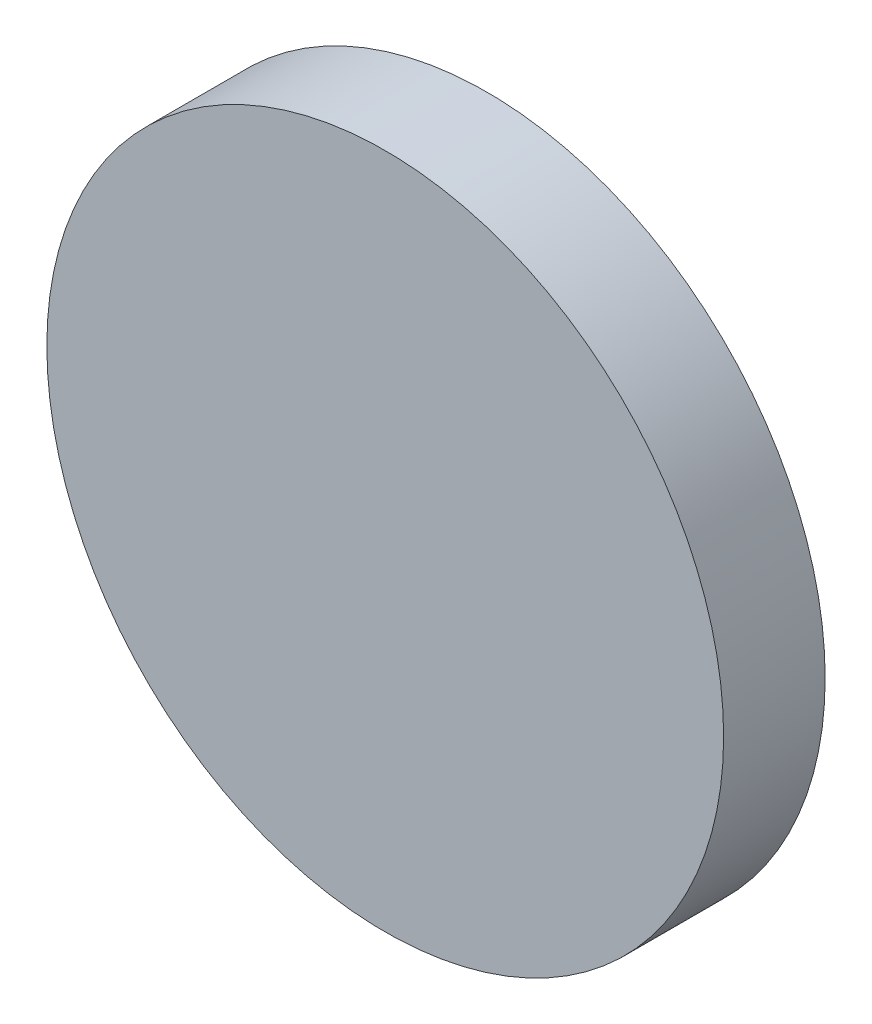
ISO-10303-21;
HEADER;
FILE_DESCRIPTION(('STEP AP214'),'2;1');
FILE_NAME('part.step','',(''),(''),'','','');
FILE_SCHEMA(('AUTOMOTIVE_DESIGN { 1 0 10303 214 1 1 1 1 }'));
ENDSEC;
DATA;
#1=APPLICATION_CONTEXT('core data for automotive mechanical design processes');
#2=APPLICATION_PROTOCOL_DEFINITION('international standard','automotive_design',2000,#1);
#3=PRODUCT_CONTEXT('',#1,'mechanical');
#4=PRODUCT('Part','Part','',(#3));
#5=PRODUCT_RELATED_PRODUCT_CATEGORY('part','',(#4));
#6=PRODUCT_DEFINITION_FORMATION('','',#4);
#7=PRODUCT_DEFINITION_CONTEXT('part definition',#1,'design');
#8=PRODUCT_DEFINITION('design','',#6,#7);
#9=PRODUCT_DEFINITION_SHAPE('','',#8);
#10=(LENGTH_UNIT() NAMED_UNIT(*) SI_UNIT(.MILLI.,.METRE.));
#11=(NAMED_UNIT(*) PLANE_ANGLE_UNIT() SI_UNIT($,.RADIAN.));
#12=(NAMED_UNIT(*) SI_UNIT($,.STERADIAN.) SOLID_ANGLE_UNIT());
#13=UNCERTAINTY_MEASURE_WITH_UNIT(LENGTH_MEASURE(1.E-05),#10,'distance_accuracy_value','');
#14=(GEOMETRIC_REPRESENTATION_CONTEXT(3) GLOBAL_UNCERTAINTY_ASSIGNED_CONTEXT((#13)) GLOBAL_UNIT_ASSIGNED_CONTEXT((#10,
#11,#12)) REPRESENTATION_CONTEXT('',''));
#15=CARTESIAN_POINT('',(0.,0.,0.));
#16=DIRECTION('',(0.,0.,1.));
#17=DIRECTION('',(1.,0.,0.));
#18=AXIS2_PLACEMENT_3D('',#15,#16,#17);
#19=CARTESIAN_POINT('',(0.,0.,3.));
#20=DIRECTION('',(0.,0.,-1.));
#21=DIRECTION('',(-1.,0.,0.));
#22=AXIS2_PLACEMENT_3D('',#19,#20,#21);
#23=CYLINDRICAL_SURFACE('',#22,10.);
#24=CARTESIAN_POINT('',(0.,0.,3.));
#25=DIRECTION('',(0.,0.,1.));
#26=DIRECTION('',(1.,0.,0.));
#27=AXIS2_PLACEMENT_3D('',#24,#25,#26);
#28=CIRCLE('',#27,10.);
#29=CARTESIAN_POINT('',(10.,0.,3.));
#30=VERTEX_POINT('',#29);
#31=EDGE_CURVE('E10',#30,#30,#28,.T.);
#32=ORIENTED_EDGE('',*,*,#31,.F.);
#33=EDGE_LOOP('',(#32));
#34=FACE_BOUND('',#33,.T.);
#35=CARTESIAN_POINT('',(0.,0.,0.));
#36=DIRECTION('',(0.,0.,1.));
#37=DIRECTION('',(1.,0.,0.));
#38=AXIS2_PLACEMENT_3D('',#35,#36,#37);
#39=CIRCLE('',#38,10.);
#40=CARTESIAN_POINT('',(10.,0.,0.));
#41=VERTEX_POINT('',#40);
#42=EDGE_CURVE('E34',#41,#41,#39,.T.);
#43=ORIENTED_EDGE('',*,*,#42,.T.);
#44=EDGE_LOOP('',(#43));
#45=FACE_BOUND('',#44,.T.);
#46=ADVANCED_FACE('F31',(#34,#45),#23,.T.);
#47=CARTESIAN_POINT('',(0.,0.,3.));
#48=DIRECTION('',(0.,0.,1.));
#49=DIRECTION('',(1.,0.,0.));
#50=AXIS2_PLACEMENT_3D('',#47,#48,#49);
#51=PLANE('',#50);
#52=ORIENTED_EDGE('',*,*,#31,.T.);
#53=EDGE_LOOP('',(#52));
#54=FACE_BOUND('',#53,.T.);
#55=ADVANCED_FACE('F46',(#54),#51,.T.);
#56=CARTESIAN_POINT('',(0.,0.,0.));
#57=DIRECTION('',(0.,0.,1.));
#58=DIRECTION('',(1.,0.,0.));
#59=AXIS2_PLACEMENT_3D('',#56,#57,#58);
#60=PLANE('',#59);
#61=ORIENTED_EDGE('',*,*,#42,.F.);
#62=EDGE_LOOP('',(#61));
#63=FACE_BOUND('',#62,.T.);
#64=ADVANCED_FACE('F44',(#63),#60,.F.);
#65=CLOSED_SHELL('',(#46,#55,#64));
#66=MANIFOLD_SOLID_BREP('B2',#65);
#67=ADVANCED_BREP_SHAPE_REPRESENTATION('',(#18,#66),#14);
#68=SHAPE_DEFINITION_REPRESENTATION(#9,#67);
ENDSEC;
END-ISO-10303-21;
